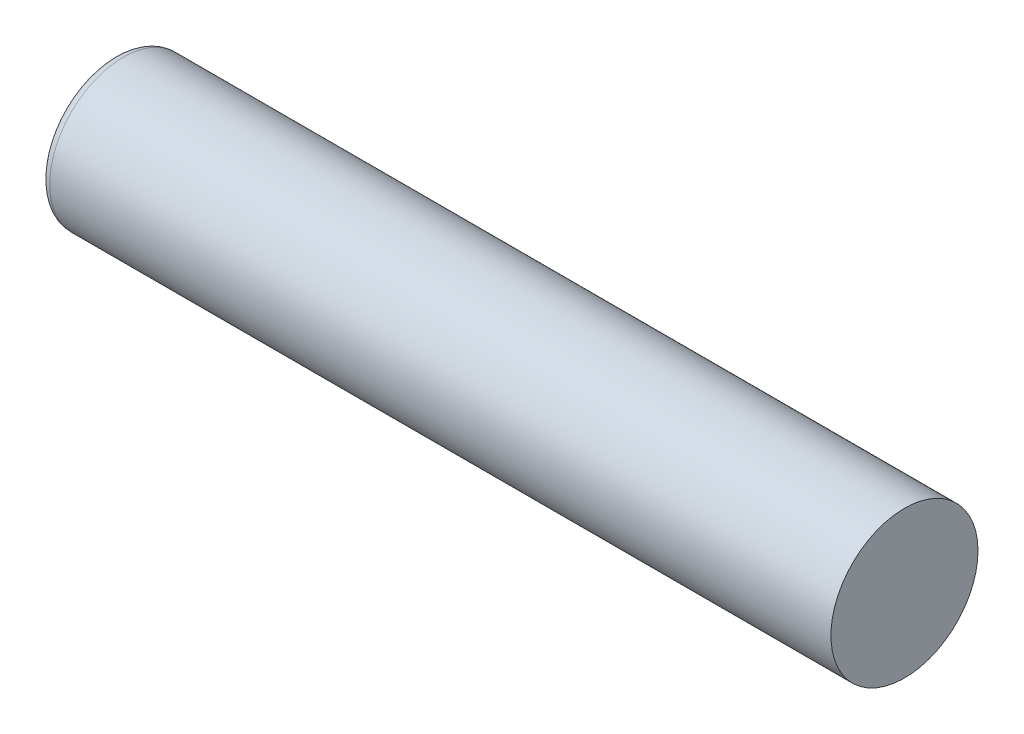
ISO-10303-21;
HEADER;
FILE_DESCRIPTION(('STEP AP214'),'2;1');
FILE_NAME('part.step','',(''),(''),'','','');
FILE_SCHEMA(('AUTOMOTIVE_DESIGN { 1 0 10303 214 1 1 1 1 }'));
ENDSEC;
DATA;
#1=APPLICATION_CONTEXT('core data for automotive mechanical design processes');
#2=APPLICATION_PROTOCOL_DEFINITION('international standard','automotive_design',2000,#1);
#3=PRODUCT_CONTEXT('',#1,'mechanical');
#4=PRODUCT('Part','Part','',(#3));
#5=PRODUCT_RELATED_PRODUCT_CATEGORY('part','',(#4));
#6=PRODUCT_DEFINITION_FORMATION('','',#4);
#7=PRODUCT_DEFINITION_CONTEXT('part definition',#1,'design');
#8=PRODUCT_DEFINITION('design','',#6,#7);
#9=PRODUCT_DEFINITION_SHAPE('','',#8);
#10=(LENGTH_UNIT() NAMED_UNIT(*) SI_UNIT(.MILLI.,.METRE.));
#11=(NAMED_UNIT(*) PLANE_ANGLE_UNIT() SI_UNIT($,.RADIAN.));
#12=(NAMED_UNIT(*) SI_UNIT($,.STERADIAN.) SOLID_ANGLE_UNIT());
#13=UNCERTAINTY_MEASURE_WITH_UNIT(LENGTH_MEASURE(1.E-05),#10,'distance_accuracy_value','');
#14=(GEOMETRIC_REPRESENTATION_CONTEXT(3) GLOBAL_UNCERTAINTY_ASSIGNED_CONTEXT((#13)) GLOBAL_UNIT_ASSIGNED_CONTEXT((#10,
#11,#12)) REPRESENTATION_CONTEXT('',''));
#15=CARTESIAN_POINT('',(0.,0.,0.));
#16=DIRECTION('',(0.,0.,1.));
#17=DIRECTION('',(1.,0.,0.));
#18=AXIS2_PLACEMENT_3D('',#15,#16,#17);
#19=CARTESIAN_POINT('',(3.,0.,0.));
#20=DIRECTION('',(-1.,0.,0.));
#21=DIRECTION('',(0.,0.,1.));
#22=AXIS2_PLACEMENT_3D('',#19,#20,#21);
#23=CYLINDRICAL_SURFACE('',#22,4.);
#24=CARTESIAN_POINT('',(0.5,0.,0.));
#25=DIRECTION('',(1.,0.,0.));
#26=DIRECTION('',(0.,0.,-1.));
#27=AXIS2_PLACEMENT_3D('',#24,#25,#26);
#28=CIRCLE('',#27,4.);
#29=CARTESIAN_POINT('',(0.5,0.,-4.));
#30=VERTEX_POINT('',#29);
#31=EDGE_CURVE('E44',#30,#30,#28,.T.);
#32=ORIENTED_EDGE('',*,*,#31,.T.);
#33=EDGE_LOOP('',(#32));
#34=FACE_BOUND('',#33,.T.);
#35=CARTESIAN_POINT('',(43.,0.,0.));
#36=DIRECTION('',(1.,0.,0.));
#37=DIRECTION('',(0.,0.,-1.));
#38=AXIS2_PLACEMENT_3D('',#35,#36,#37);
#39=CIRCLE('',#38,4.);
#40=CARTESIAN_POINT('',(43.,0.,-4.));
#41=VERTEX_POINT('',#40);
#42=EDGE_CURVE('E48',#41,#41,#39,.T.);
#43=ORIENTED_EDGE('',*,*,#42,.F.);
#44=EDGE_LOOP('',(#43));
#45=FACE_BOUND('',#44,.T.);
#46=ADVANCED_FACE('F37',(#34,#45),#23,.T.);
#47=CARTESIAN_POINT('',(0.,0.,0.));
#48=DIRECTION('',(1.,0.,0.));
#49=DIRECTION('',(0.,0.,-1.));
#50=AXIS2_PLACEMENT_3D('',#47,#48,#49);
#51=PLANE('',#50);
#52=CARTESIAN_POINT('',(0.,0.,0.));
#53=DIRECTION('',(1.,0.,0.));
#54=DIRECTION('',(0.,0.,-1.));
#55=AXIS2_PLACEMENT_3D('',#52,#53,#54);
#56=CIRCLE('',#55,3.5);
#57=CARTESIAN_POINT('',(0.,0.,-3.5));
#58=VERTEX_POINT('',#57);
#59=EDGE_CURVE('E10',#58,#58,#56,.F.);
#60=ORIENTED_EDGE('',*,*,#59,.T.);
#61=EDGE_LOOP('',(#60));
#62=FACE_BOUND('',#61,.T.);
#63=ADVANCED_FACE('F58',(#62),#51,.F.);
#64=CARTESIAN_POINT('',(43.,0.,0.));
#65=DIRECTION('',(1.,0.,0.));
#66=DIRECTION('',(0.,0.,-1.));
#67=AXIS2_PLACEMENT_3D('',#64,#65,#66);
#68=PLANE('',#67);
#69=ORIENTED_EDGE('',*,*,#42,.T.);
#70=EDGE_LOOP('',(#69));
#71=FACE_BOUND('',#70,.T.);
#72=ADVANCED_FACE('F55',(#71),#68,.T.);
#73=CARTESIAN_POINT('',(0.5,0.,0.));
#74=DIRECTION('',(1.,0.,0.));
#75=DIRECTION('',(0.,0.,-1.));
#76=AXIS2_PLACEMENT_3D('',#73,#74,#75);
#77=TOROIDAL_SURFACE('',#76,3.5,0.5);
#78=ORIENTED_EDGE('',*,*,#59,.F.);
#79=EDGE_LOOP('',(#78));
#80=FACE_BOUND('',#79,.T.);
#81=ORIENTED_EDGE('',*,*,#31,.F.);
#82=EDGE_LOOP('',(#81));
#83=FACE_BOUND('',#82,.T.);
#84=ADVANCED_FACE('F39',(#80,#83),#77,.T.);
#85=CLOSED_SHELL('',(#46,#63,#72,#84));
#86=MANIFOLD_SOLID_BREP('B2',#85);
#87=ADVANCED_BREP_SHAPE_REPRESENTATION('',(#18,#86),#14);
#88=SHAPE_DEFINITION_REPRESENTATION(#9,#87);
ENDSEC;
END-ISO-10303-21;
